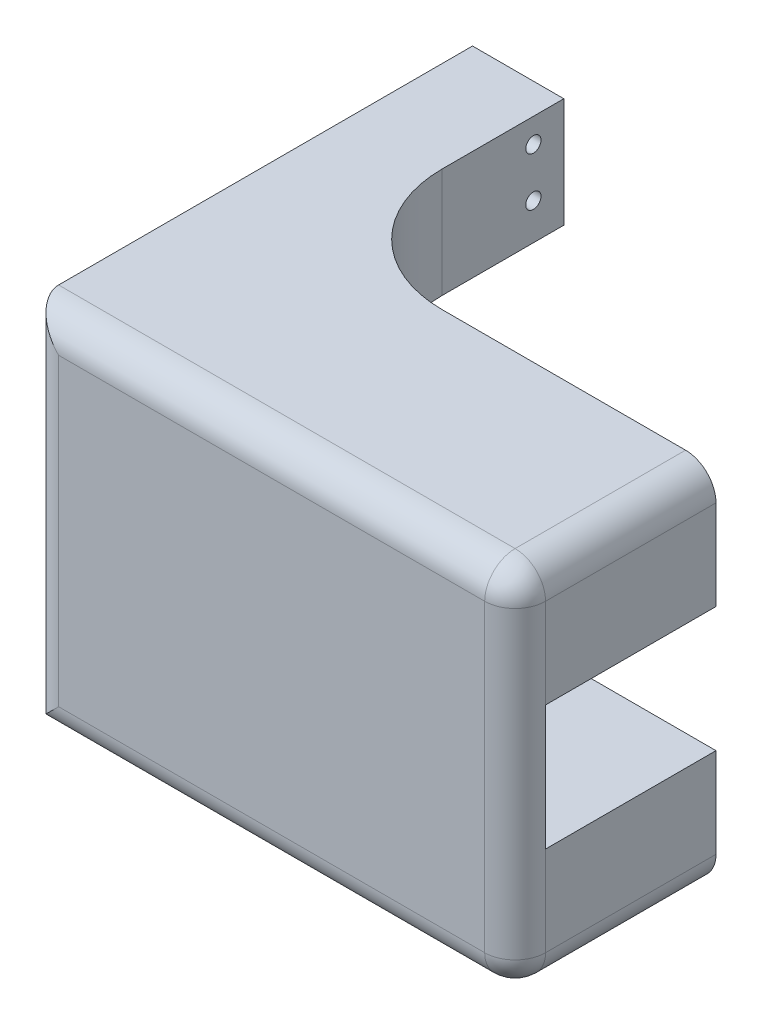
ISO-10303-21;
HEADER;
FILE_DESCRIPTION(('STEP AP214'),'2;1');
FILE_NAME('part.step','',(''),(''),'','','');
FILE_SCHEMA(('AUTOMOTIVE_DESIGN { 1 0 10303 214 1 1 1 1 }'));
ENDSEC;
DATA;
#1=APPLICATION_CONTEXT('core data for automotive mechanical design processes');
#2=APPLICATION_PROTOCOL_DEFINITION('international standard','automotive_design',2000,#1);
#3=PRODUCT_CONTEXT('',#1,'mechanical');
#4=PRODUCT('Part','Part','',(#3));
#5=PRODUCT_RELATED_PRODUCT_CATEGORY('part','',(#4));
#6=PRODUCT_DEFINITION_FORMATION('','',#4);
#7=PRODUCT_DEFINITION_CONTEXT('part definition',#1,'design');
#8=PRODUCT_DEFINITION('design','',#6,#7);
#9=PRODUCT_DEFINITION_SHAPE('','',#8);
#10=(LENGTH_UNIT() NAMED_UNIT(*) SI_UNIT(.MILLI.,.METRE.));
#11=(NAMED_UNIT(*) PLANE_ANGLE_UNIT() SI_UNIT($,.RADIAN.));
#12=(NAMED_UNIT(*) SI_UNIT($,.STERADIAN.) SOLID_ANGLE_UNIT());
#13=UNCERTAINTY_MEASURE_WITH_UNIT(LENGTH_MEASURE(1.E-05),#10,'distance_accuracy_value','');
#14=(GEOMETRIC_REPRESENTATION_CONTEXT(3) GLOBAL_UNCERTAINTY_ASSIGNED_CONTEXT((#13)) GLOBAL_UNIT_ASSIGNED_CONTEXT((#10,
#11,#12)) REPRESENTATION_CONTEXT('',''));
#15=CARTESIAN_POINT('',(0.,0.,0.));
#16=DIRECTION('',(0.,0.,1.));
#17=DIRECTION('',(1.,0.,0.));
#18=AXIS2_PLACEMENT_3D('',#15,#16,#17);
#19=CARTESIAN_POINT('',(40.,30.,33.));
#20=DIRECTION('',(-1.,0.,0.));
#21=DIRECTION('',(0.,-1.,0.));
#22=AXIS2_PLACEMENT_3D('',#19,#20,#21);
#23=PLANE('',#22);
#24=DIRECTION('',(0.,1.,0.));
#25=VECTOR('',#24,1.);
#26=CARTESIAN_POINT('',(40.,30.,0.));
#27=LINE('',#26,#25);
#28=CARTESIAN_POINT('',(40.,10.25,0.));
#29=VERTEX_POINT('',#28);
#30=CARTESIAN_POINT('',(40.,25.,0.));
#31=VERTEX_POINT('',#30);
#32=EDGE_CURVE('E274',#29,#31,#27,.T.);
#33=ORIENTED_EDGE('',*,*,#32,.T.);
#34=DIRECTION('',(0.,0.,-1.));
#35=VECTOR('',#34,1.);
#36=CARTESIAN_POINT('',(40.,25.,33.));
#37=LINE('',#36,#35);
#38=CARTESIAN_POINT('',(40.,25.,28.));
#39=VERTEX_POINT('',#38);
#40=EDGE_CURVE('E351',#31,#39,#37,.F.);
#41=ORIENTED_EDGE('',*,*,#40,.T.);
#42=DIRECTION('',(0.,1.,0.));
#43=VECTOR('',#42,1.);
#44=CARTESIAN_POINT('',(40.,-30.,28.));
#45=LINE('',#44,#43);
#46=CARTESIAN_POINT('',(40.,10.25,28.));
#47=VERTEX_POINT('',#46);
#48=EDGE_CURVE('E325',#39,#47,#45,.F.);
#49=ORIENTED_EDGE('',*,*,#48,.T.);
#50=DIRECTION('',(0.,0.,-1.));
#51=VECTOR('',#50,1.);
#52=CARTESIAN_POINT('',(40.,10.25,28.));
#53=LINE('',#52,#51);
#54=EDGE_CURVE('E248',#47,#29,#53,.T.);
#55=ORIENTED_EDGE('',*,*,#54,.T.);
#56=EDGE_LOOP('',(#33,#41,#49,#55));
#57=FACE_BOUND('',#56,.T.);
#58=ADVANCED_FACE('F43',(#57),#23,.F.);
#59=CARTESIAN_POINT('',(0.,0.,0.));
#60=DIRECTION('',(0.,0.,1.));
#61=DIRECTION('',(1.,0.,0.));
#62=AXIS2_PLACEMENT_3D('',#59,#60,#61);
#63=PLANE('',#62);
#64=DIRECTION('',(0.,1.,0.));
#65=VECTOR('',#64,1.);
#66=CARTESIAN_POINT('',(-5.,0.,0.));
#67=LINE('',#66,#65);
#68=CARTESIAN_POINT('',(-5.,-30.,0.));
#69=VERTEX_POINT('',#68);
#70=CARTESIAN_POINT('',(-5.,-11.,0.));
#71=VERTEX_POINT('',#70);
#72=EDGE_CURVE('E292',#69,#71,#67,.T.);
#73=ORIENTED_EDGE('',*,*,#72,.T.);
#74=DIRECTION('',(-1.,0.,0.));
#75=VECTOR('',#74,1.);
#76=CARTESIAN_POINT('',(0.,-11.,0.));
#77=LINE('',#76,#75);
#78=CARTESIAN_POINT('',(-40.,-11.,0.));
#79=VERTEX_POINT('',#78);
#80=EDGE_CURVE('E365',#71,#79,#77,.T.);
#81=ORIENTED_EDGE('',*,*,#80,.T.);
#82=DIRECTION('',(0.,-1.,0.));
#83=VECTOR('',#82,1.);
#84=CARTESIAN_POINT('',(-40.,30.,0.));
#85=LINE('',#84,#83);
#86=CARTESIAN_POINT('',(-40.,11.,0.));
#87=VERTEX_POINT('',#86);
#88=EDGE_CURVE('E279',#87,#79,#85,.T.);
#89=ORIENTED_EDGE('',*,*,#88,.F.);
#90=DIRECTION('',(1.,0.,0.));
#91=VECTOR('',#90,1.);
#92=CARTESIAN_POINT('',(0.,11.,0.));
#93=LINE('',#92,#91);
#94=CARTESIAN_POINT('',(-5.00000000000001,11.,0.));
#95=VERTEX_POINT('',#94);
#96=EDGE_CURVE('E357',#87,#95,#93,.T.);
#97=ORIENTED_EDGE('',*,*,#96,.T.);
#98=DIRECTION('',(0.,1.,0.));
#99=VECTOR('',#98,1.);
#100=CARTESIAN_POINT('',(-5.00000000000001,0.,0.));
#101=LINE('',#100,#99);
#102=CARTESIAN_POINT('',(-5.00000000000001,30.,0.));
#103=VERTEX_POINT('',#102);
#104=EDGE_CURVE('E289',#95,#103,#101,.T.);
#105=ORIENTED_EDGE('',*,*,#104,.T.);
#106=DIRECTION('',(-1.,0.,0.));
#107=VECTOR('',#106,1.);
#108=CARTESIAN_POINT('',(-40.,30.,0.));
#109=LINE('',#108,#107);
#110=CARTESIAN_POINT('',(35.,30.,0.));
#111=VERTEX_POINT('',#110);
#112=EDGE_CURVE('E277',#111,#103,#109,.T.);
#113=ORIENTED_EDGE('',*,*,#112,.F.);
#114=CARTESIAN_POINT('',(35.,25.,0.));
#115=DIRECTION('',(0.,0.,1.));
#116=DIRECTION('',(1.,0.,0.));
#117=AXIS2_PLACEMENT_3D('',#114,#115,#116);
#118=CIRCLE('',#117,5.);
#119=EDGE_CURVE('E349',#111,#31,#118,.F.);
#120=ORIENTED_EDGE('',*,*,#119,.T.);
#121=ORIENTED_EDGE('',*,*,#32,.F.);
#122=DIRECTION('',(1.,0.,0.));
#123=VECTOR('',#122,1.);
#124=CARTESIAN_POINT('',(-20.35,10.25,0.));
#125=LINE('',#124,#123);
#126=CARTESIAN_POINT('',(-20.35,10.25,0.));
#127=VERTEX_POINT('',#126);
#128=EDGE_CURVE('E266',#127,#29,#125,.T.);
#129=ORIENTED_EDGE('',*,*,#128,.F.);
#130=DIRECTION('',(0.,-1.,0.));
#131=VECTOR('',#130,1.);
#132=CARTESIAN_POINT('',(-20.35,10.25,0.));
#133=LINE('',#132,#131);
#134=CARTESIAN_POINT('',(-20.35,-10.25,0.));
#135=VERTEX_POINT('',#134);
#136=EDGE_CURVE('E258',#127,#135,#133,.T.);
#137=ORIENTED_EDGE('',*,*,#136,.T.);
#138=DIRECTION('',(1.,0.,0.));
#139=VECTOR('',#138,1.);
#140=CARTESIAN_POINT('',(-20.35,-10.25,0.));
#141=LINE('',#140,#139);
#142=CARTESIAN_POINT('',(40.,-10.25,0.));
#143=VERTEX_POINT('',#142);
#144=EDGE_CURVE('E254',#135,#143,#141,.T.);
#145=ORIENTED_EDGE('',*,*,#144,.T.);
#146=CARTESIAN_POINT('',(40.,-25.,0.));
#147=VERTEX_POINT('',#146);
#148=EDGE_CURVE('E275',#147,#143,#27,.T.);
#149=ORIENTED_EDGE('',*,*,#148,.F.);
#150=CARTESIAN_POINT('',(35.,-25.,0.));
#151=DIRECTION('',(0.,0.,1.));
#152=DIRECTION('',(1.,0.,0.));
#153=AXIS2_PLACEMENT_3D('',#150,#151,#152);
#154=CIRCLE('',#153,5.);
#155=CARTESIAN_POINT('',(35.,-30.,0.));
#156=VERTEX_POINT('',#155);
#157=EDGE_CURVE('E347',#147,#156,#154,.F.);
#158=ORIENTED_EDGE('',*,*,#157,.T.);
#159=DIRECTION('',(1.,0.,0.));
#160=VECTOR('',#159,1.);
#161=CARTESIAN_POINT('',(-40.,-30.,0.));
#162=LINE('',#161,#160);
#163=EDGE_CURVE('E282',#69,#156,#162,.T.);
#164=ORIENTED_EDGE('',*,*,#163,.F.);
#165=EDGE_LOOP('',(#73,#81,#89,#97,#105,#113,#120,#121,#129,#137,#145,#149,#158,#164));
#166=FACE_BOUND('',#165,.T.);
#167=ADVANCED_FACE('F433',(#166),#63,.F.);
#168=DIRECTION('',(0.,1.,0.));
#169=VECTOR('',#168,1.);
#170=CARTESIAN_POINT('',(40.,-30.,28.));
#171=LINE('',#170,#169);
#172=CARTESIAN_POINT('',(40.,-10.25,28.));
#173=VERTEX_POINT('',#172);
#174=CARTESIAN_POINT('',(40.,-25.,28.));
#175=VERTEX_POINT('',#174);
#176=EDGE_CURVE('E322',#173,#175,#171,.F.);
#177=ORIENTED_EDGE('',*,*,#176,.T.);
#178=DIRECTION('',(0.,0.,-1.));
#179=VECTOR('',#178,1.);
#180=CARTESIAN_POINT('',(40.,-25.,33.));
#181=LINE('',#180,#179);
#182=EDGE_CURVE('E353',#175,#147,#181,.T.);
#183=ORIENTED_EDGE('',*,*,#182,.T.);
#184=ORIENTED_EDGE('',*,*,#148,.T.);
#185=DIRECTION('',(0.,0.,-1.));
#186=VECTOR('',#185,1.);
#187=CARTESIAN_POINT('',(40.,-10.25,28.));
#188=LINE('',#187,#186);
#189=EDGE_CURVE('E251',#173,#143,#188,.T.);
#190=ORIENTED_EDGE('',*,*,#189,.F.);
#191=EDGE_LOOP('',(#177,#183,#184,#190));
#192=FACE_BOUND('',#191,.T.);
#193=ADVANCED_FACE('F435',(#192),#23,.F.);
#194=CARTESIAN_POINT('',(-40.,30.,33.));
#195=DIRECTION('',(0.,-1.,0.));
#196=DIRECTION('',(0.,0.,-1.));
#197=AXIS2_PLACEMENT_3D('',#194,#195,#196);
#198=PLANE('',#197);
#199=DIRECTION('',(-1.,0.,0.));
#200=VECTOR('',#199,1.);
#201=CARTESIAN_POINT('',(40.,30.,28.));
#202=LINE('',#201,#200);
#203=CARTESIAN_POINT('',(-40.,30.,28.));
#204=VERTEX_POINT('',#203);
#205=CARTESIAN_POINT('',(35.,30.,28.));
#206=VERTEX_POINT('',#205);
#207=EDGE_CURVE('E319',#204,#206,#202,.F.);
#208=ORIENTED_EDGE('',*,*,#207,.T.);
#209=DIRECTION('',(0.,0.,-1.));
#210=VECTOR('',#209,1.);
#211=CARTESIAN_POINT('',(35.,30.,33.));
#212=LINE('',#211,#210);
#213=EDGE_CURVE('E345',#206,#111,#212,.T.);
#214=ORIENTED_EDGE('',*,*,#213,.T.);
#215=ORIENTED_EDGE('',*,*,#112,.T.);
#216=CARTESIAN_POINT('',(-5.00000000000001,30.,-20.));
#217=DIRECTION('',(0.,-1.,0.));
#218=DIRECTION('',(0.,0.,-1.));
#219=AXIS2_PLACEMENT_3D('',#216,#217,#218);
#220=CIRCLE('',#219,20.);
#221=CARTESIAN_POINT('',(-25.,30.,-20.));
#222=VERTEX_POINT('',#221);
#223=EDGE_CURVE('E301',#103,#222,#220,.T.);
#224=ORIENTED_EDGE('',*,*,#223,.T.);
#225=DIRECTION('',(0.,0.,1.));
#226=VECTOR('',#225,1.);
#227=CARTESIAN_POINT('',(-25.,30.,-40.));
#228=LINE('',#227,#226);
#229=CARTESIAN_POINT('',(-25.,30.,-40.));
#230=VERTEX_POINT('',#229);
#231=EDGE_CURVE('E238',#230,#222,#228,.T.);
#232=ORIENTED_EDGE('',*,*,#231,.F.);
#233=DIRECTION('',(-1.,0.,0.));
#234=VECTOR('',#233,1.);
#235=CARTESIAN_POINT('',(-40.,30.,-40.));
#236=LINE('',#235,#234);
#237=CARTESIAN_POINT('',(-40.,30.,-40.));
#238=VERTEX_POINT('',#237);
#239=EDGE_CURVE('E234',#230,#238,#236,.T.);
#240=ORIENTED_EDGE('',*,*,#239,.T.);
#241=DIRECTION('',(0.,0.,-1.));
#242=VECTOR('',#241,1.);
#243=CARTESIAN_POINT('',(-40.,30.,33.));
#244=LINE('',#243,#242);
#245=EDGE_CURVE('E287',#204,#238,#244,.T.);
#246=ORIENTED_EDGE('',*,*,#245,.F.);
#247=EDGE_LOOP('',(#208,#214,#215,#224,#232,#240,#246));
#248=FACE_BOUND('',#247,.T.);
#249=ADVANCED_FACE('F444',(#248),#198,.F.);
#250=CARTESIAN_POINT('',(-40.,30.,33.));
#251=DIRECTION('',(1.,0.,0.));
#252=DIRECTION('',(0.,1.,0.));
#253=AXIS2_PLACEMENT_3D('',#250,#251,#252);
#254=PLANE('',#253);
#255=CARTESIAN_POINT('',(-40.,18.,-35.));
#256=DIRECTION('',(1.,0.,0.));
#257=DIRECTION('',(0.,0.,-1.));
#258=AXIS2_PLACEMENT_3D('',#255,#256,#257);
#259=CIRCLE('',#258,1.25);
#260=CARTESIAN_POINT('',(-40.,18.,-36.25));
#261=VERTEX_POINT('',#260);
#262=EDGE_CURVE('E538',#261,#261,#259,.T.);
#263=ORIENTED_EDGE('',*,*,#262,.T.);
#264=EDGE_LOOP('',(#263));
#265=FACE_BOUND('',#264,.T.);
#266=CARTESIAN_POINT('',(-40.,-18.,-35.));
#267=DIRECTION('',(1.,0.,0.));
#268=DIRECTION('',(0.,0.,-1.));
#269=AXIS2_PLACEMENT_3D('',#266,#267,#268);
#270=CIRCLE('',#269,1.25);
#271=CARTESIAN_POINT('',(-40.,-18.,-36.25));
#272=VERTEX_POINT('',#271);
#273=EDGE_CURVE('E542',#272,#272,#270,.T.);
#274=ORIENTED_EDGE('',*,*,#273,.T.);
#275=EDGE_LOOP('',(#274));
#276=FACE_BOUND('',#275,.T.);
#277=CARTESIAN_POINT('',(-40.,26.,-35.));
#278=DIRECTION('',(1.,0.,0.));
#279=DIRECTION('',(0.,0.,-1.));
#280=AXIS2_PLACEMENT_3D('',#277,#278,#279);
#281=CIRCLE('',#280,1.25);
#282=CARTESIAN_POINT('',(-40.,26.,-36.25));
#283=VERTEX_POINT('',#282);
#284=EDGE_CURVE('E546',#283,#283,#281,.T.);
#285=ORIENTED_EDGE('',*,*,#284,.T.);
#286=EDGE_LOOP('',(#285));
#287=FACE_BOUND('',#286,.T.);
#288=CARTESIAN_POINT('',(-40.,-26.,-35.));
#289=DIRECTION('',(1.,0.,0.));
#290=DIRECTION('',(0.,0.,-1.));
#291=AXIS2_PLACEMENT_3D('',#288,#289,#290);
#292=CIRCLE('',#291,1.25);
#293=CARTESIAN_POINT('',(-40.,-26.,-36.25));
#294=VERTEX_POINT('',#293);
#295=EDGE_CURVE('E203',#294,#294,#292,.T.);
#296=ORIENTED_EDGE('',*,*,#295,.T.);
#297=EDGE_LOOP('',(#296));
#298=FACE_BOUND('',#297,.T.);
#299=DIRECTION('',(0.,0.,-1.));
#300=VECTOR('',#299,1.);
#301=CARTESIAN_POINT('',(-40.,-30.,33.));
#302=LINE('',#301,#300);
#303=CARTESIAN_POINT('',(-40.,-30.,28.));
#304=VERTEX_POINT('',#303);
#305=CARTESIAN_POINT('',(-40.,-30.,-40.));
#306=VERTEX_POINT('',#305);
#307=EDGE_CURVE('E285',#304,#306,#302,.T.);
#308=ORIENTED_EDGE('',*,*,#307,.F.);
#309=DIRECTION('',(0.,-1.,0.));
#310=VECTOR('',#309,1.);
#311=CARTESIAN_POINT('',(-40.,30.,28.));
#312=LINE('',#311,#310);
#313=EDGE_CURVE('E317',#304,#204,#312,.F.);
#314=ORIENTED_EDGE('',*,*,#313,.T.);
#315=ORIENTED_EDGE('',*,*,#245,.T.);
#316=DIRECTION('',(0.,-1.,0.));
#317=VECTOR('',#316,1.);
#318=CARTESIAN_POINT('',(-40.,12.,-40.));
#319=LINE('',#318,#317);
#320=CARTESIAN_POINT('',(-40.,12.,-40.));
#321=VERTEX_POINT('',#320);
#322=EDGE_CURVE('E213',#238,#321,#319,.T.);
#323=ORIENTED_EDGE('',*,*,#322,.T.);
#324=DIRECTION('',(0.,0.,1.));
#325=VECTOR('',#324,1.);
#326=CARTESIAN_POINT('',(-40.,12.,-40.));
#327=LINE('',#326,#325);
#328=CARTESIAN_POINT('',(-40.,12.,-1.));
#329=VERTEX_POINT('',#328);
#330=EDGE_CURVE('E237',#321,#329,#327,.T.);
#331=ORIENTED_EDGE('',*,*,#330,.T.);
#332=CARTESIAN_POINT('',(-40.,11.,-1.));
#333=DIRECTION('',(1.,0.,0.));
#334=DIRECTION('',(0.,1.,0.));
#335=AXIS2_PLACEMENT_3D('',#332,#333,#334);
#336=CIRCLE('',#335,1.);
#337=EDGE_CURVE('E11',#329,#87,#336,.T.);
#338=ORIENTED_EDGE('',*,*,#337,.T.);
#339=ORIENTED_EDGE('',*,*,#88,.T.);
#340=CARTESIAN_POINT('',(-40.,-11.,-1.));
#341=DIRECTION('',(1.,0.,0.));
#342=DIRECTION('',(0.,1.,0.));
#343=AXIS2_PLACEMENT_3D('',#340,#341,#342);
#344=CIRCLE('',#343,1.);
#345=CARTESIAN_POINT('',(-40.,-12.,-1.));
#346=VERTEX_POINT('',#345);
#347=EDGE_CURVE('E371',#79,#346,#344,.T.);
#348=ORIENTED_EDGE('',*,*,#347,.T.);
#349=DIRECTION('',(0.,0.,1.));
#350=VECTOR('',#349,1.);
#351=CARTESIAN_POINT('',(-40.,-12.,-40.));
#352=LINE('',#351,#350);
#353=CARTESIAN_POINT('',(-40.,-12.,-40.));
#354=VERTEX_POINT('',#353);
#355=EDGE_CURVE('E219',#354,#346,#352,.T.);
#356=ORIENTED_EDGE('',*,*,#355,.F.);
#357=DIRECTION('',(0.,-1.,0.));
#358=VECTOR('',#357,1.);
#359=CARTESIAN_POINT('',(-40.,-30.,-40.));
#360=LINE('',#359,#358);
#361=EDGE_CURVE('E212',#354,#306,#360,.T.);
#362=ORIENTED_EDGE('',*,*,#361,.T.);
#363=EDGE_LOOP('',(#308,#314,#315,#323,#331,#338,#339,#348,#356,#362));
#364=FACE_BOUND('',#363,.T.);
#365=ADVANCED_FACE('F449',(#265,#276,#287,#298,#364),#254,.F.);
#366=CARTESIAN_POINT('',(-40.,-30.,33.));
#367=DIRECTION('',(0.,1.,0.));
#368=DIRECTION('',(0.,0.,1.));
#369=AXIS2_PLACEMENT_3D('',#366,#367,#368);
#370=PLANE('',#369);
#371=ORIENTED_EDGE('',*,*,#163,.T.);
#372=DIRECTION('',(0.,0.,-1.));
#373=VECTOR('',#372,1.);
#374=CARTESIAN_POINT('',(35.,-30.,33.));
#375=LINE('',#374,#373);
#376=CARTESIAN_POINT('',(35.,-30.,28.));
#377=VERTEX_POINT('',#376);
#378=EDGE_CURVE('E355',#156,#377,#375,.F.);
#379=ORIENTED_EDGE('',*,*,#378,.T.);
#380=DIRECTION('',(1.,0.,0.));
#381=VECTOR('',#380,1.);
#382=CARTESIAN_POINT('',(-40.,-30.,28.));
#383=LINE('',#382,#381);
#384=EDGE_CURVE('E315',#377,#304,#383,.F.);
#385=ORIENTED_EDGE('',*,*,#384,.T.);
#386=ORIENTED_EDGE('',*,*,#307,.T.);
#387=DIRECTION('',(1.,0.,0.));
#388=VECTOR('',#387,1.);
#389=CARTESIAN_POINT('',(-25.,-30.,-40.));
#390=LINE('',#389,#388);
#391=CARTESIAN_POINT('',(-25.,-30.,-40.));
#392=VERTEX_POINT('',#391);
#393=EDGE_CURVE('E218',#306,#392,#390,.T.);
#394=ORIENTED_EDGE('',*,*,#393,.T.);
#395=DIRECTION('',(0.,0.,1.));
#396=VECTOR('',#395,1.);
#397=CARTESIAN_POINT('',(-25.,-30.,-40.));
#398=LINE('',#397,#396);
#399=CARTESIAN_POINT('',(-25.,-30.,-20.));
#400=VERTEX_POINT('',#399);
#401=EDGE_CURVE('E202',#392,#400,#398,.T.);
#402=ORIENTED_EDGE('',*,*,#401,.T.);
#403=CARTESIAN_POINT('',(-5.,-30.,-20.));
#404=DIRECTION('',(0.,1.,0.));
#405=DIRECTION('',(0.,0.,1.));
#406=AXIS2_PLACEMENT_3D('',#403,#404,#405);
#407=CIRCLE('',#406,20.);
#408=EDGE_CURVE('E299',#400,#69,#407,.T.);
#409=ORIENTED_EDGE('',*,*,#408,.T.);
#410=EDGE_LOOP('',(#371,#379,#385,#386,#394,#402,#409));
#411=FACE_BOUND('',#410,.T.);
#412=ADVANCED_FACE('F475',(#411),#370,.F.);
#413=CARTESIAN_POINT('',(0.,0.,33.));
#414=DIRECTION('',(0.,0.,1.));
#415=DIRECTION('',(1.,0.,0.));
#416=AXIS2_PLACEMENT_3D('',#413,#414,#415);
#417=PLANE('',#416);
#418=DIRECTION('',(0.,-1.,0.));
#419=VECTOR('',#418,1.);
#420=CARTESIAN_POINT('',(-35.,-30.,33.));
#421=LINE('',#420,#419);
#422=CARTESIAN_POINT('',(-35.,25.,33.));
#423=VERTEX_POINT('',#422);
#424=CARTESIAN_POINT('',(-35.,-25.,33.));
#425=VERTEX_POINT('',#424);
#426=EDGE_CURVE('E310',#423,#425,#421,.T.);
#427=ORIENTED_EDGE('',*,*,#426,.T.);
#428=DIRECTION('',(1.,0.,0.));
#429=VECTOR('',#428,1.);
#430=CARTESIAN_POINT('',(40.,-25.,33.));
#431=LINE('',#430,#429);
#432=CARTESIAN_POINT('',(35.,-25.,33.));
#433=VERTEX_POINT('',#432);
#434=EDGE_CURVE('E312',#425,#433,#431,.T.);
#435=ORIENTED_EDGE('',*,*,#434,.T.);
#436=DIRECTION('',(0.,1.,0.));
#437=VECTOR('',#436,1.);
#438=CARTESIAN_POINT('',(35.,30.,33.));
#439=LINE('',#438,#437);
#440=CARTESIAN_POINT('',(35.,25.,33.));
#441=VERTEX_POINT('',#440);
#442=EDGE_CURVE('E305',#433,#441,#439,.T.);
#443=ORIENTED_EDGE('',*,*,#442,.T.);
#444=DIRECTION('',(-1.,0.,0.));
#445=VECTOR('',#444,1.);
#446=CARTESIAN_POINT('',(-40.,25.,33.));
#447=LINE('',#446,#445);
#448=EDGE_CURVE('E308',#441,#423,#447,.T.);
#449=ORIENTED_EDGE('',*,*,#448,.T.);
#450=EDGE_LOOP('',(#427,#435,#443,#449));
#451=FACE_BOUND('',#450,.T.);
#452=ADVANCED_FACE('F466',(#451),#417,.T.);
#453=CARTESIAN_POINT('',(-20.35,-10.25,28.));
#454=DIRECTION('',(0.,1.,0.));
#455=DIRECTION('',(0.,0.,1.));
#456=AXIS2_PLACEMENT_3D('',#453,#454,#455);
#457=PLANE('',#456);
#458=ORIENTED_EDGE('',*,*,#144,.F.);
#459=DIRECTION('',(0.,0.,-1.));
#460=VECTOR('',#459,1.);
#461=CARTESIAN_POINT('',(-20.35,-10.25,28.));
#462=LINE('',#461,#460);
#463=CARTESIAN_POINT('',(-20.35,-10.25,28.));
#464=VERTEX_POINT('',#463);
#465=EDGE_CURVE('E263',#464,#135,#462,.T.);
#466=ORIENTED_EDGE('',*,*,#465,.F.);
#467=DIRECTION('',(1.,0.,0.));
#468=VECTOR('',#467,1.);
#469=CARTESIAN_POINT('',(-20.35,-10.25,28.));
#470=LINE('',#469,#468);
#471=EDGE_CURVE('E255',#464,#173,#470,.T.);
#472=ORIENTED_EDGE('',*,*,#471,.T.);
#473=ORIENTED_EDGE('',*,*,#189,.T.);
#474=EDGE_LOOP('',(#458,#466,#472,#473));
#475=FACE_BOUND('',#474,.T.);
#476=ADVANCED_FACE('F518',(#475),#457,.T.);
#477=CARTESIAN_POINT('',(-20.35,10.25,28.));
#478=DIRECTION('',(0.,1.,0.));
#479=DIRECTION('',(0.,0.,1.));
#480=AXIS2_PLACEMENT_3D('',#477,#478,#479);
#481=PLANE('',#480);
#482=ORIENTED_EDGE('',*,*,#128,.T.);
#483=ORIENTED_EDGE('',*,*,#54,.F.);
#484=DIRECTION('',(1.,0.,0.));
#485=VECTOR('',#484,1.);
#486=CARTESIAN_POINT('',(-20.35,10.25,28.));
#487=LINE('',#486,#485);
#488=CARTESIAN_POINT('',(-20.35,10.25,28.));
#489=VERTEX_POINT('',#488);
#490=EDGE_CURVE('E257',#489,#47,#487,.T.);
#491=ORIENTED_EDGE('',*,*,#490,.F.);
#492=DIRECTION('',(0.,0.,-1.));
#493=VECTOR('',#492,1.);
#494=CARTESIAN_POINT('',(-20.35,10.25,28.));
#495=LINE('',#494,#493);
#496=EDGE_CURVE('E272',#489,#127,#495,.T.);
#497=ORIENTED_EDGE('',*,*,#496,.T.);
#498=EDGE_LOOP('',(#482,#483,#491,#497));
#499=FACE_BOUND('',#498,.T.);
#500=ADVANCED_FACE('F507',(#499),#481,.F.);
#501=CARTESIAN_POINT('',(-20.35,10.25,28.));
#502=DIRECTION('',(1.,0.,0.));
#503=DIRECTION('',(0.,1.,0.));
#504=AXIS2_PLACEMENT_3D('',#501,#502,#503);
#505=PLANE('',#504);
#506=ORIENTED_EDGE('',*,*,#136,.F.);
#507=ORIENTED_EDGE('',*,*,#496,.F.);
#508=DIRECTION('',(0.,-1.,0.));
#509=VECTOR('',#508,1.);
#510=CARTESIAN_POINT('',(-20.35,10.25,28.));
#511=LINE('',#510,#509);
#512=EDGE_CURVE('E261',#489,#464,#511,.T.);
#513=ORIENTED_EDGE('',*,*,#512,.T.);
#514=ORIENTED_EDGE('',*,*,#465,.T.);
#515=EDGE_LOOP('',(#506,#507,#513,#514));
#516=FACE_BOUND('',#515,.T.);
#517=ADVANCED_FACE('F516',(#516),#505,.T.);
#518=CARTESIAN_POINT('',(0.,0.,28.));
#519=DIRECTION('',(0.,0.,-1.));
#520=DIRECTION('',(-1.,0.,0.));
#521=AXIS2_PLACEMENT_3D('',#518,#519,#520);
#522=PLANE('',#521);
#523=ORIENTED_EDGE('',*,*,#471,.F.);
#524=ORIENTED_EDGE('',*,*,#512,.F.);
#525=ORIENTED_EDGE('',*,*,#490,.T.);
#526=DIRECTION('',(0.,1.,0.));
#527=VECTOR('',#526,1.);
#528=CARTESIAN_POINT('',(40.,10.25,28.));
#529=LINE('',#528,#527);
#530=EDGE_CURVE('E241',#173,#47,#529,.T.);
#531=ORIENTED_EDGE('',*,*,#530,.F.);
#532=EDGE_LOOP('',(#523,#524,#525,#531));
#533=FACE_BOUND('',#532,.T.);
#534=ADVANCED_FACE('F511',(#533),#522,.T.);
#535=CARTESIAN_POINT('',(-25.,30.,-40.));
#536=DIRECTION('',(1.,0.,0.));
#537=DIRECTION('',(0.,0.,-1.));
#538=AXIS2_PLACEMENT_3D('',#535,#536,#537);
#539=PLANE('',#538);
#540=CARTESIAN_POINT('',(-25.,18.,-35.));
#541=DIRECTION('',(1.,0.,0.));
#542=DIRECTION('',(0.,0.,-1.));
#543=AXIS2_PLACEMENT_3D('',#540,#541,#542);
#544=CIRCLE('',#543,1.24999999999999);
#545=CARTESIAN_POINT('',(-25.,18.,-36.25));
#546=VERTEX_POINT('',#545);
#547=EDGE_CURVE('E335',#546,#546,#544,.T.);
#548=ORIENTED_EDGE('',*,*,#547,.F.);
#549=EDGE_LOOP('',(#548));
#550=FACE_BOUND('',#549,.T.);
#551=CARTESIAN_POINT('',(-25.,26.,-35.));
#552=DIRECTION('',(1.,0.,0.));
#553=DIRECTION('',(0.,0.,-1.));
#554=AXIS2_PLACEMENT_3D('',#551,#552,#553);
#555=CIRCLE('',#554,1.24999999999999);
#556=CARTESIAN_POINT('',(-25.,26.,-36.25));
#557=VERTEX_POINT('',#556);
#558=EDGE_CURVE('E556',#557,#557,#555,.T.);
#559=ORIENTED_EDGE('',*,*,#558,.F.);
#560=EDGE_LOOP('',(#559));
#561=FACE_BOUND('',#560,.T.);
#562=ORIENTED_EDGE('',*,*,#231,.T.);
#563=DIRECTION('',(0.,1.,0.));
#564=VECTOR('',#563,1.);
#565=CARTESIAN_POINT('',(-25.,30.,-20.));
#566=LINE('',#565,#564);
#567=CARTESIAN_POINT('',(-25.,12.,-20.));
#568=VERTEX_POINT('',#567);
#569=EDGE_CURVE('E296',#222,#568,#566,.F.);
#570=ORIENTED_EDGE('',*,*,#569,.T.);
#571=DIRECTION('',(0.,0.,1.));
#572=VECTOR('',#571,1.);
#573=CARTESIAN_POINT('',(-25.,12.,-40.));
#574=LINE('',#573,#572);
#575=CARTESIAN_POINT('',(-25.,12.,-40.));
#576=VERTEX_POINT('',#575);
#577=EDGE_CURVE('E242',#576,#568,#574,.T.);
#578=ORIENTED_EDGE('',*,*,#577,.F.);
#579=DIRECTION('',(0.,1.,0.));
#580=VECTOR('',#579,1.);
#581=CARTESIAN_POINT('',(-25.,30.,-40.));
#582=LINE('',#581,#580);
#583=EDGE_CURVE('E231',#576,#230,#582,.T.);
#584=ORIENTED_EDGE('',*,*,#583,.T.);
#585=EDGE_LOOP('',(#562,#570,#578,#584));
#586=FACE_BOUND('',#585,.T.);
#587=ADVANCED_FACE('F491',(#550,#561,#586),#539,.T.);
#588=CARTESIAN_POINT('',(-25.,12.,-40.));
#589=DIRECTION('',(0.,-1.,0.));
#590=DIRECTION('',(0.,0.,-1.));
#591=AXIS2_PLACEMENT_3D('',#588,#589,#590);
#592=PLANE('',#591);
#593=CARTESIAN_POINT('',(-5.00000000000001,12.,-20.));
#594=DIRECTION('',(0.,-1.,0.));
#595=DIRECTION('',(0.,0.,-1.));
#596=AXIS2_PLACEMENT_3D('',#593,#594,#595);
#597=CIRCLE('',#596,20.);
#598=CARTESIAN_POINT('',(-11.2449979983984,12.,-1.));
#599=VERTEX_POINT('',#598);
#600=EDGE_CURVE('E303',#568,#599,#597,.F.);
#601=ORIENTED_EDGE('',*,*,#600,.T.);
#602=DIRECTION('',(1.,0.,0.));
#603=VECTOR('',#602,1.);
#604=CARTESIAN_POINT('',(-25.,12.,-1.));
#605=LINE('',#604,#603);
#606=EDGE_CURVE('E65',#599,#329,#605,.F.);
#607=ORIENTED_EDGE('',*,*,#606,.T.);
#608=ORIENTED_EDGE('',*,*,#330,.F.);
#609=DIRECTION('',(1.,0.,0.));
#610=VECTOR('',#609,1.);
#611=CARTESIAN_POINT('',(-25.,12.,-40.));
#612=LINE('',#611,#610);
#613=EDGE_CURVE('E228',#321,#576,#612,.T.);
#614=ORIENTED_EDGE('',*,*,#613,.T.);
#615=ORIENTED_EDGE('',*,*,#577,.T.);
#616=EDGE_LOOP('',(#601,#607,#608,#614,#615));
#617=FACE_BOUND('',#616,.T.);
#618=ADVANCED_FACE('F570',(#617),#592,.T.);
#619=CARTESIAN_POINT('',(0.,0.,-40.));
#620=DIRECTION('',(0.,0.,-1.));
#621=DIRECTION('',(-1.,0.,0.));
#622=AXIS2_PLACEMENT_3D('',#619,#620,#621);
#623=PLANE('',#622);
#624=ORIENTED_EDGE('',*,*,#322,.F.);
#625=ORIENTED_EDGE('',*,*,#239,.F.);
#626=ORIENTED_EDGE('',*,*,#583,.F.);
#627=ORIENTED_EDGE('',*,*,#613,.F.);
#628=EDGE_LOOP('',(#624,#625,#626,#627));
#629=FACE_BOUND('',#628,.T.);
#630=ADVANCED_FACE('F497',(#629),#623,.T.);
#631=CARTESIAN_POINT('',(-40.,-12.,-40.));
#632=DIRECTION('',(0.,1.,0.));
#633=DIRECTION('',(0.,0.,1.));
#634=AXIS2_PLACEMENT_3D('',#631,#632,#633);
#635=PLANE('',#634);
#636=ORIENTED_EDGE('',*,*,#355,.T.);
#637=DIRECTION('',(-1.,0.,0.));
#638=VECTOR('',#637,1.);
#639=CARTESIAN_POINT('',(-40.,-12.,-1.));
#640=LINE('',#639,#638);
#641=CARTESIAN_POINT('',(-11.2449979983984,-12.,-1.));
#642=VERTEX_POINT('',#641);
#643=EDGE_CURVE('E368',#346,#642,#640,.F.);
#644=ORIENTED_EDGE('',*,*,#643,.T.);
#645=CARTESIAN_POINT('',(-5.,-12.,-20.));
#646=DIRECTION('',(0.,1.,0.));
#647=DIRECTION('',(0.,0.,1.));
#648=AXIS2_PLACEMENT_3D('',#645,#646,#647);
#649=CIRCLE('',#648,20.);
#650=CARTESIAN_POINT('',(-25.,-12.,-20.));
#651=VERTEX_POINT('',#650);
#652=EDGE_CURVE('E198',#642,#651,#649,.F.);
#653=ORIENTED_EDGE('',*,*,#652,.T.);
#654=DIRECTION('',(0.,0.,1.));
#655=VECTOR('',#654,1.);
#656=CARTESIAN_POINT('',(-25.,-12.,-40.));
#657=LINE('',#656,#655);
#658=CARTESIAN_POINT('',(-25.,-12.,-40.));
#659=VERTEX_POINT('',#658);
#660=EDGE_CURVE('E192',#659,#651,#657,.T.);
#661=ORIENTED_EDGE('',*,*,#660,.F.);
#662=DIRECTION('',(-1.,0.,0.));
#663=VECTOR('',#662,1.);
#664=CARTESIAN_POINT('',(-40.,-12.,-40.));
#665=LINE('',#664,#663);
#666=EDGE_CURVE('E196',#659,#354,#665,.T.);
#667=ORIENTED_EDGE('',*,*,#666,.T.);
#668=EDGE_LOOP('',(#636,#644,#653,#661,#667));
#669=FACE_BOUND('',#668,.T.);
#670=ADVANCED_FACE('F195',(#669),#635,.T.);
#671=CARTESIAN_POINT('',(-25.,-12.,-40.));
#672=DIRECTION('',(1.,0.,0.));
#673=DIRECTION('',(0.,0.,-1.));
#674=AXIS2_PLACEMENT_3D('',#671,#672,#673);
#675=PLANE('',#674);
#676=CARTESIAN_POINT('',(-25.,-18.,-35.));
#677=DIRECTION('',(1.,0.,0.));
#678=DIRECTION('',(0.,0.,-1.));
#679=AXIS2_PLACEMENT_3D('',#676,#677,#678);
#680=CIRCLE('',#679,1.24999999999999);
#681=CARTESIAN_POINT('',(-25.,-18.,-36.25));
#682=VERTEX_POINT('',#681);
#683=EDGE_CURVE('E560',#682,#682,#680,.T.);
#684=ORIENTED_EDGE('',*,*,#683,.F.);
#685=EDGE_LOOP('',(#684));
#686=FACE_BOUND('',#685,.T.);
#687=CARTESIAN_POINT('',(-25.,-26.,-35.));
#688=DIRECTION('',(1.,0.,0.));
#689=DIRECTION('',(0.,0.,-1.));
#690=AXIS2_PLACEMENT_3D('',#687,#688,#689);
#691=CIRCLE('',#690,1.24999999999999);
#692=CARTESIAN_POINT('',(-25.,-26.,-36.25));
#693=VERTEX_POINT('',#692);
#694=EDGE_CURVE('E550',#693,#693,#691,.T.);
#695=ORIENTED_EDGE('',*,*,#694,.F.);
#696=EDGE_LOOP('',(#695));
#697=FACE_BOUND('',#696,.T.);
#698=ORIENTED_EDGE('',*,*,#660,.T.);
#699=DIRECTION('',(0.,1.,0.));
#700=VECTOR('',#699,1.);
#701=CARTESIAN_POINT('',(-25.,-12.,-20.));
#702=LINE('',#701,#700);
#703=EDGE_CURVE('E294',#651,#400,#702,.F.);
#704=ORIENTED_EDGE('',*,*,#703,.T.);
#705=ORIENTED_EDGE('',*,*,#401,.F.);
#706=DIRECTION('',(0.,1.,0.));
#707=VECTOR('',#706,1.);
#708=CARTESIAN_POINT('',(-25.,-12.,-40.));
#709=LINE('',#708,#707);
#710=EDGE_CURVE('E210',#392,#659,#709,.T.);
#711=ORIENTED_EDGE('',*,*,#710,.T.);
#712=EDGE_LOOP('',(#698,#704,#705,#711));
#713=FACE_BOUND('',#712,.T.);
#714=ADVANCED_FACE('F215',(#686,#697,#713),#675,.T.);
#715=CARTESIAN_POINT('',(0.,0.,-40.));
#716=DIRECTION('',(0.,0.,-1.));
#717=DIRECTION('',(-1.,0.,0.));
#718=AXIS2_PLACEMENT_3D('',#715,#716,#717);
#719=PLANE('',#718);
#720=ORIENTED_EDGE('',*,*,#666,.F.);
#721=ORIENTED_EDGE('',*,*,#710,.F.);
#722=ORIENTED_EDGE('',*,*,#393,.F.);
#723=ORIENTED_EDGE('',*,*,#361,.F.);
#724=EDGE_LOOP('',(#720,#721,#722,#723));
#725=FACE_BOUND('',#724,.T.);
#726=ADVANCED_FACE('F208',(#725),#719,.T.);
#727=CARTESIAN_POINT('',(-25.,-26.,-35.));
#728=DIRECTION('',(1.,0.,0.));
#729=DIRECTION('',(0.,0.,-1.));
#730=AXIS2_PLACEMENT_3D('',#727,#728,#729);
#731=CYLINDRICAL_SURFACE('',#730,1.24999999999999);
#732=ORIENTED_EDGE('',*,*,#295,.F.);
#733=EDGE_LOOP('',(#732));
#734=FACE_BOUND('',#733,.T.);
#735=ORIENTED_EDGE('',*,*,#694,.T.);
#736=EDGE_LOOP('',(#735));
#737=FACE_BOUND('',#736,.T.);
#738=ADVANCED_FACE('F577',(#734,#737),#731,.F.);
#739=CARTESIAN_POINT('',(-25.,26.,-35.));
#740=DIRECTION('',(1.,0.,0.));
#741=DIRECTION('',(0.,0.,-1.));
#742=AXIS2_PLACEMENT_3D('',#739,#740,#741);
#743=CYLINDRICAL_SURFACE('',#742,1.24999999999999);
#744=ORIENTED_EDGE('',*,*,#284,.F.);
#745=EDGE_LOOP('',(#744));
#746=FACE_BOUND('',#745,.T.);
#747=ORIENTED_EDGE('',*,*,#558,.T.);
#748=EDGE_LOOP('',(#747));
#749=FACE_BOUND('',#748,.T.);
#750=ADVANCED_FACE('F574',(#746,#749),#743,.F.);
#751=CARTESIAN_POINT('',(-25.,-18.,-35.));
#752=DIRECTION('',(1.,0.,0.));
#753=DIRECTION('',(0.,0.,-1.));
#754=AXIS2_PLACEMENT_3D('',#751,#752,#753);
#755=CYLINDRICAL_SURFACE('',#754,1.24999999999999);
#756=ORIENTED_EDGE('',*,*,#273,.F.);
#757=EDGE_LOOP('',(#756));
#758=FACE_BOUND('',#757,.T.);
#759=ORIENTED_EDGE('',*,*,#683,.T.);
#760=EDGE_LOOP('',(#759));
#761=FACE_BOUND('',#760,.T.);
#762=ADVANCED_FACE('F576',(#758,#761),#755,.F.);
#763=CARTESIAN_POINT('',(-25.,18.,-35.));
#764=DIRECTION('',(1.,0.,0.));
#765=DIRECTION('',(0.,0.,-1.));
#766=AXIS2_PLACEMENT_3D('',#763,#764,#765);
#767=CYLINDRICAL_SURFACE('',#766,1.24999999999999);
#768=ORIENTED_EDGE('',*,*,#262,.F.);
#769=EDGE_LOOP('',(#768));
#770=FACE_BOUND('',#769,.T.);
#771=ORIENTED_EDGE('',*,*,#547,.T.);
#772=EDGE_LOOP('',(#771));
#773=FACE_BOUND('',#772,.T.);
#774=ADVANCED_FACE('F430',(#770,#773),#767,.F.);
#775=CARTESIAN_POINT('',(-5.,0.,-20.));
#776=DIRECTION('',(0.,1.,0.));
#777=DIRECTION('',(0.,0.,1.));
#778=AXIS2_PLACEMENT_3D('',#775,#776,#777);
#779=CYLINDRICAL_SURFACE('',#778,20.);
#780=ORIENTED_EDGE('',*,*,#408,.F.);
#781=ORIENTED_EDGE('',*,*,#703,.F.);
#782=ORIENTED_EDGE('',*,*,#652,.F.);
#783=CARTESIAN_POINT('',(-11.2449979983984,-12.,-1.));
#784=CARTESIAN_POINT('',(-11.1653251247962,-11.9999950767671,-0.973812559325959));
#785=CARTESIAN_POINT('',(-11.0854941344297,-11.998971904392,-0.948128915986986));
#786=CARTESIAN_POINT('',(-10.9255643569066,-11.9950834396215,-0.897782523045144));
#787=CARTESIAN_POINT('',(-10.8454655997435,-11.9922183470936,-0.873119662985655));
#788=CARTESIAN_POINT('',(-10.6049180418729,-11.9811560983058,-0.800705063052154));
#789=CARTESIAN_POINT('',(-10.4441148553273,-11.970491460907,-0.754493423513592));
#790=CARTESIAN_POINT('',(-10.1220184344648,-11.9437956167235,-0.666278650959206));
#791=CARTESIAN_POINT('',(-9.96072597366461,-11.9277705786573,-0.624270752166464));
#792=CARTESIAN_POINT('',(-9.63759188882753,-11.8912643836756,-0.54439790038472));
#793=CARTESIAN_POINT('',(-9.47575014287233,-11.8707821637801,-0.506533938913874));
#794=CARTESIAN_POINT('',(-8.95879046818651,-11.7995709639232,-0.392347231619582));
#795=CARTESIAN_POINT('',(-8.60286075363368,-11.7418534786262,-0.323878435289675));
#796=CARTESIAN_POINT('',(-7.88987648708413,-11.6147822648001,-0.206584409705536));
#797=CARTESIAN_POINT('',(-7.53282154346316,-11.5454239097856,-0.157767016920284));
#798=CARTESIAN_POINT('',(-6.46034727639636,-11.3265635659703,-0.0404264500747519));
#799=CARTESIAN_POINT('',(-5.74358239522852,-11.1662703511418,-0.00100697450336135));
#800=CARTESIAN_POINT('',(-5.01840162071492,-11.0041146958628,-6.35185491321617E-06));
#801=CARTESIAN_POINT('',(-5.00920074279109,-11.0020573163566,-2.90788565250056E-09));
#802=CARTESIAN_POINT('',(-5.,-11.,0.));
#803=B_SPLINE_CURVE_WITH_KNOTS('',3,(#783,#784,#785,#786,#787,#788,#789,#790,#791,#792,#793,
#794,#795,#796,#797,#798,#799,#800,#801,#802),.UNSPECIFIED.,.F.,.F.,(4,2,2,2,2,2,2,2,2,4),(0.,
0.251579466840637,0.503131639290344,1.00591075695234,1.50811325849083,2.01043566031304,
3.11052898446623,4.21106056370161,6.41201196552983,6.44029624320449),.UNSPECIFIED.);
#804=EDGE_CURVE('E373',#642,#71,#803,.T.);
#805=ORIENTED_EDGE('',*,*,#804,.T.);
#806=ORIENTED_EDGE('',*,*,#72,.F.);
#807=EDGE_LOOP('',(#780,#781,#782,#805,#806));
#808=FACE_BOUND('',#807,.T.);
#809=ADVANCED_FACE('F385',(#808),#779,.F.);
#810=CARTESIAN_POINT('',(-5.00000000000001,0.,-20.));
#811=DIRECTION('',(0.,1.,0.));
#812=DIRECTION('',(0.,0.,1.));
#813=AXIS2_PLACEMENT_3D('',#810,#811,#812);
#814=CYLINDRICAL_SURFACE('',#813,20.);
#815=ORIENTED_EDGE('',*,*,#600,.F.);
#816=ORIENTED_EDGE('',*,*,#569,.F.);
#817=ORIENTED_EDGE('',*,*,#223,.F.);
#818=ORIENTED_EDGE('',*,*,#104,.F.);
#819=CARTESIAN_POINT('',(-11.2449979983984,12.,-1.));
#820=CARTESIAN_POINT('',(-11.1653251247963,11.9999950767671,-0.973812559325959));
#821=CARTESIAN_POINT('',(-11.0854941344297,11.998971904392,-0.948128915986986));
#822=CARTESIAN_POINT('',(-10.9255643569066,11.9950834396215,-0.897782523045144));
#823=CARTESIAN_POINT('',(-10.8454655997435,11.9922183470936,-0.873119662985655));
#824=CARTESIAN_POINT('',(-10.6049180418729,11.9811560983057,-0.800705063052154));
#825=CARTESIAN_POINT('',(-10.4441148553273,11.970491460907,-0.754493423513592));
#826=CARTESIAN_POINT('',(-10.1220184344648,11.9437956167235,-0.666278650959206));
#827=CARTESIAN_POINT('',(-9.96072597366462,11.9277705786573,-0.624270752166464));
#828=CARTESIAN_POINT('',(-9.63759188882754,11.8912643836756,-0.54439790038472));
#829=CARTESIAN_POINT('',(-9.47575014287234,11.8707821637801,-0.506533938913874));
#830=CARTESIAN_POINT('',(-8.95879046818652,11.7995709639232,-0.392347231619582));
#831=CARTESIAN_POINT('',(-8.60286075363368,11.7418534786262,-0.323878435289675));
#832=CARTESIAN_POINT('',(-7.88987648708414,11.6147822648001,-0.206584409705536));
#833=CARTESIAN_POINT('',(-7.53282154346317,11.5454239097856,-0.157767016920284));
#834=CARTESIAN_POINT('',(-6.46034727639637,11.3265635659703,-0.0404264500747519));
#835=CARTESIAN_POINT('',(-5.74358239522853,11.1662703511418,-0.00100697450336135));
#836=CARTESIAN_POINT('',(-5.01840162071493,11.0041146958628,-6.35185491321617E-06));
#837=CARTESIAN_POINT('',(-5.0092007427911,11.0020573163566,-2.90788565250056E-09));
#838=CARTESIAN_POINT('',(-5.00000000000001,11.,0.));
#839=B_SPLINE_CURVE_WITH_KNOTS('',3,(#819,#820,#821,#822,#823,#824,#825,#826,#827,#828,#829,
#830,#831,#832,#833,#834,#835,#836,#837,#838),.UNSPECIFIED.,.F.,.F.,(4,2,2,2,2,2,2,2,2,4),(0.,
0.251579466840637,0.503131639290344,1.00591075695234,1.50811325849083,2.01043566031304,
3.11052898446623,4.21106056370161,6.41201196552983,6.44029624320449),.UNSPECIFIED.);
#840=EDGE_CURVE('E52',#95,#599,#839,.F.);
#841=ORIENTED_EDGE('',*,*,#840,.T.);
#842=EDGE_LOOP('',(#815,#816,#817,#818,#841));
#843=FACE_BOUND('',#842,.T.);
#844=ADVANCED_FACE('F414',(#843),#814,.F.);
#845=CARTESIAN_POINT('',(0.,25.,28.));
#846=DIRECTION('',(1.,0.,0.));
#847=DIRECTION('',(0.,0.,-1.));
#848=AXIS2_PLACEMENT_3D('',#845,#846,#847);
#849=CYLINDRICAL_SURFACE('',#848,5.);
#850=ORIENTED_EDGE('',*,*,#448,.F.);
#851=CARTESIAN_POINT('',(35.,25.,28.));
#852=DIRECTION('',(1.,0.,0.));
#853=DIRECTION('',(0.,0.,-1.));
#854=AXIS2_PLACEMENT_3D('',#851,#852,#853);
#855=CIRCLE('',#854,5.);
#856=EDGE_CURVE('E340',#441,#206,#855,.F.);
#857=ORIENTED_EDGE('',*,*,#856,.T.);
#858=ORIENTED_EDGE('',*,*,#207,.F.);
#859=CARTESIAN_POINT('',(-35.,25.,28.));
#860=DIRECTION('',(0.707106781186547,0.707106781186548,0.));
#861=DIRECTION('',(0.707106781186548,-0.707106781186547,0.));
#862=AXIS2_PLACEMENT_3D('',#859,#860,#861);
#863=ELLIPSE('',#862,7.07106781186548,5.);
#864=EDGE_CURVE('E331',#423,#204,#863,.F.);
#865=ORIENTED_EDGE('',*,*,#864,.F.);
#866=EDGE_LOOP('',(#850,#857,#858,#865));
#867=FACE_BOUND('',#866,.T.);
#868=ADVANCED_FACE('F410',(#867),#849,.T.);
#869=CARTESIAN_POINT('',(-35.,0.,28.));
#870=DIRECTION('',(0.,1.,0.));
#871=DIRECTION('',(-1.,0.,0.));
#872=AXIS2_PLACEMENT_3D('',#869,#870,#871);
#873=CYLINDRICAL_SURFACE('',#872,5.);
#874=ORIENTED_EDGE('',*,*,#864,.T.);
#875=ORIENTED_EDGE('',*,*,#313,.F.);
#876=CARTESIAN_POINT('',(-35.,-25.,28.));
#877=DIRECTION('',(-0.707106781186548,0.707106781186547,0.));
#878=DIRECTION('',(0.707106781186547,0.707106781186548,0.));
#879=AXIS2_PLACEMENT_3D('',#876,#877,#878);
#880=ELLIPSE('',#879,7.07106781186548,5.);
#881=EDGE_CURVE('E328',#425,#304,#880,.F.);
#882=ORIENTED_EDGE('',*,*,#881,.F.);
#883=ORIENTED_EDGE('',*,*,#426,.F.);
#884=EDGE_LOOP('',(#874,#875,#882,#883));
#885=FACE_BOUND('',#884,.T.);
#886=ADVANCED_FACE('F413',(#885),#873,.T.);
#887=CARTESIAN_POINT('',(35.,0.,28.));
#888=DIRECTION('',(0.,-1.,0.));
#889=DIRECTION('',(1.,0.,0.));
#890=AXIS2_PLACEMENT_3D('',#887,#888,#889);
#891=CYLINDRICAL_SURFACE('',#890,5.);
#892=ORIENTED_EDGE('',*,*,#48,.F.);
#893=CARTESIAN_POINT('',(35.,25.,28.));
#894=DIRECTION('',(0.,-1.,0.));
#895=DIRECTION('',(1.,0.,0.));
#896=AXIS2_PLACEMENT_3D('',#893,#894,#895);
#897=CIRCLE('',#896,5.);
#898=EDGE_CURVE('E337',#39,#441,#897,.T.);
#899=ORIENTED_EDGE('',*,*,#898,.T.);
#900=ORIENTED_EDGE('',*,*,#442,.F.);
#901=CARTESIAN_POINT('',(35.,-25.,28.));
#902=DIRECTION('',(0.,-1.,0.));
#903=DIRECTION('',(1.,0.,0.));
#904=AXIS2_PLACEMENT_3D('',#901,#902,#903);
#905=CIRCLE('',#904,5.);
#906=EDGE_CURVE('E327',#433,#175,#905,.F.);
#907=ORIENTED_EDGE('',*,*,#906,.T.);
#908=ORIENTED_EDGE('',*,*,#176,.F.);
#909=ORIENTED_EDGE('',*,*,#530,.T.);
#910=EDGE_LOOP('',(#892,#899,#900,#907,#908,#909));
#911=FACE_BOUND('',#910,.T.);
#912=ADVANCED_FACE('F418',(#911),#891,.T.);
#913=CARTESIAN_POINT('',(0.,-25.,28.));
#914=DIRECTION('',(-1.,0.,0.));
#915=DIRECTION('',(0.,0.,1.));
#916=AXIS2_PLACEMENT_3D('',#913,#914,#915);
#917=CYLINDRICAL_SURFACE('',#916,5.);
#918=ORIENTED_EDGE('',*,*,#384,.F.);
#919=CARTESIAN_POINT('',(35.,-25.,28.));
#920=DIRECTION('',(-1.,0.,0.));
#921=DIRECTION('',(0.,0.,1.));
#922=AXIS2_PLACEMENT_3D('',#919,#920,#921);
#923=CIRCLE('',#922,5.);
#924=EDGE_CURVE('E342',#377,#433,#923,.T.);
#925=ORIENTED_EDGE('',*,*,#924,.T.);
#926=ORIENTED_EDGE('',*,*,#434,.F.);
#927=ORIENTED_EDGE('',*,*,#881,.T.);
#928=EDGE_LOOP('',(#918,#925,#926,#927));
#929=FACE_BOUND('',#928,.T.);
#930=ADVANCED_FACE('F405',(#929),#917,.T.);
#931=CARTESIAN_POINT('',(35.,25.,33.));
#932=DIRECTION('',(0.,0.,-1.));
#933=DIRECTION('',(-1.,0.,0.));
#934=AXIS2_PLACEMENT_3D('',#931,#932,#933);
#935=CYLINDRICAL_SURFACE('',#934,5.);
#936=ORIENTED_EDGE('',*,*,#119,.F.);
#937=ORIENTED_EDGE('',*,*,#213,.F.);
#938=CARTESIAN_POINT('',(35.,25.,28.));
#939=DIRECTION('',(0.,0.,1.));
#940=DIRECTION('',(1.,0.,0.));
#941=AXIS2_PLACEMENT_3D('',#938,#939,#940);
#942=CIRCLE('',#941,5.);
#943=EDGE_CURVE('E332',#39,#206,#942,.T.);
#944=ORIENTED_EDGE('',*,*,#943,.F.);
#945=ORIENTED_EDGE('',*,*,#40,.F.);
#946=EDGE_LOOP('',(#936,#937,#944,#945));
#947=FACE_BOUND('',#946,.T.);
#948=ADVANCED_FACE('F402',(#947),#935,.T.);
#949=CARTESIAN_POINT('',(35.,25.,28.));
#950=DIRECTION('',(0.,0.,1.));
#951=DIRECTION('',(1.,0.,0.));
#952=AXIS2_PLACEMENT_3D('',#949,#950,#951);
#953=SPHERICAL_SURFACE('',#952,5.);
#954=ORIENTED_EDGE('',*,*,#943,.T.);
#955=ORIENTED_EDGE('',*,*,#856,.F.);
#956=ORIENTED_EDGE('',*,*,#898,.F.);
#957=EDGE_LOOP('',(#954,#955,#956));
#958=FACE_BOUND('',#957,.T.);
#959=ADVANCED_FACE('F397',(#958),#953,.T.);
#960=CARTESIAN_POINT('',(35.,-25.,33.));
#961=DIRECTION('',(0.,0.,-1.));
#962=DIRECTION('',(-1.,0.,0.));
#963=AXIS2_PLACEMENT_3D('',#960,#961,#962);
#964=CYLINDRICAL_SURFACE('',#963,5.);
#965=ORIENTED_EDGE('',*,*,#157,.F.);
#966=ORIENTED_EDGE('',*,*,#182,.F.);
#967=CARTESIAN_POINT('',(35.,-25.,28.));
#968=DIRECTION('',(0.,0.,1.));
#969=DIRECTION('',(1.,0.,0.));
#970=AXIS2_PLACEMENT_3D('',#967,#968,#969);
#971=CIRCLE('',#970,5.);
#972=EDGE_CURVE('E360',#377,#175,#971,.T.);
#973=ORIENTED_EDGE('',*,*,#972,.F.);
#974=ORIENTED_EDGE('',*,*,#378,.F.);
#975=EDGE_LOOP('',(#965,#966,#973,#974));
#976=FACE_BOUND('',#975,.T.);
#977=ADVANCED_FACE('F394',(#976),#964,.T.);
#978=CARTESIAN_POINT('',(35.,-25.,28.));
#979=DIRECTION('',(0.,0.,1.));
#980=DIRECTION('',(1.,0.,0.));
#981=AXIS2_PLACEMENT_3D('',#978,#979,#980);
#982=SPHERICAL_SURFACE('',#981,5.);
#983=ORIENTED_EDGE('',*,*,#972,.T.);
#984=ORIENTED_EDGE('',*,*,#906,.F.);
#985=ORIENTED_EDGE('',*,*,#924,.F.);
#986=EDGE_LOOP('',(#983,#984,#985));
#987=FACE_BOUND('',#986,.T.);
#988=ADVANCED_FACE('F392',(#987),#982,.T.);
#989=CARTESIAN_POINT('',(0.,-11.,-1.));
#990=DIRECTION('',(-1.,0.,0.));
#991=DIRECTION('',(0.,0.,1.));
#992=AXIS2_PLACEMENT_3D('',#989,#990,#991);
#993=CYLINDRICAL_SURFACE('',#992,1.);
#994=ORIENTED_EDGE('',*,*,#804,.F.);
#995=ORIENTED_EDGE('',*,*,#643,.F.);
#996=ORIENTED_EDGE('',*,*,#347,.F.);
#997=ORIENTED_EDGE('',*,*,#80,.F.);
#998=EDGE_LOOP('',(#994,#995,#996,#997));
#999=FACE_BOUND('',#998,.T.);
#1000=ADVANCED_FACE('F388',(#999),#993,.F.);
#1001=CARTESIAN_POINT('',(0.,11.,-1.));
#1002=DIRECTION('',(1.,0.,0.));
#1003=DIRECTION('',(0.,0.,-1.));
#1004=AXIS2_PLACEMENT_3D('',#1001,#1002,#1003);
#1005=CYLINDRICAL_SURFACE('',#1004,1.);
#1006=ORIENTED_EDGE('',*,*,#337,.F.);
#1007=ORIENTED_EDGE('',*,*,#606,.F.);
#1008=ORIENTED_EDGE('',*,*,#840,.F.);
#1009=ORIENTED_EDGE('',*,*,#96,.F.);
#1010=EDGE_LOOP('',(#1006,#1007,#1008,#1009));
#1011=FACE_BOUND('',#1010,.T.);
#1012=ADVANCED_FACE('F45',(#1011),#1005,.F.);
#1013=CLOSED_SHELL('',(#58,#167,#193,#249,#365,#412,#452,#476,#500,#517,#534,#587,#618,#630,
#670,#714,#726,#738,#750,#762,#774,#809,#844,#868,#886,#912,#930,#948,#959,#977,#988,#1000,#1012));
#1014=MANIFOLD_SOLID_BREP('B2',#1013);
#1015=ADVANCED_BREP_SHAPE_REPRESENTATION('',(#18,#1014),#14);
#1016=SHAPE_DEFINITION_REPRESENTATION(#9,#1015);
ENDSEC;
END-ISO-10303-21;
